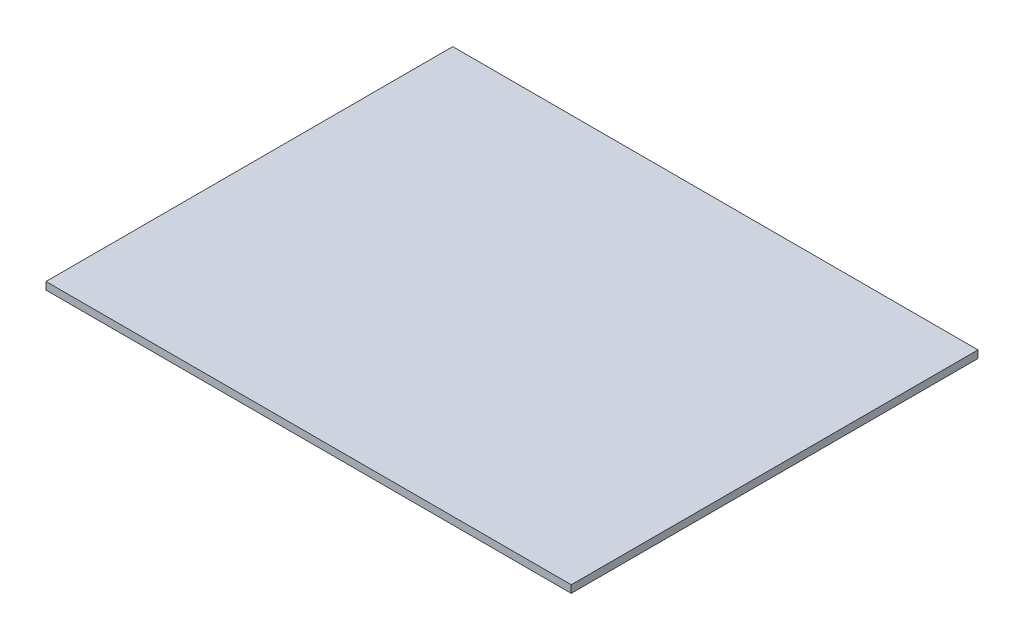
ISO-10303-21;
HEADER;
FILE_DESCRIPTION(('STEP AP214'),'2;1');
FILE_NAME('part.step','',(''),(''),'','','');
FILE_SCHEMA(('AUTOMOTIVE_DESIGN { 1 0 10303 214 1 1 1 1 }'));
ENDSEC;
DATA;
#1=APPLICATION_CONTEXT('core data for automotive mechanical design processes');
#2=APPLICATION_PROTOCOL_DEFINITION('international standard','automotive_design',2000,#1);
#3=PRODUCT_CONTEXT('',#1,'mechanical');
#4=PRODUCT('Part','Part','',(#3));
#5=PRODUCT_RELATED_PRODUCT_CATEGORY('part','',(#4));
#6=PRODUCT_DEFINITION_FORMATION('','',#4);
#7=PRODUCT_DEFINITION_CONTEXT('part definition',#1,'design');
#8=PRODUCT_DEFINITION('design','',#6,#7);
#9=PRODUCT_DEFINITION_SHAPE('','',#8);
#10=(LENGTH_UNIT() NAMED_UNIT(*) SI_UNIT(.MILLI.,.METRE.));
#11=(NAMED_UNIT(*) PLANE_ANGLE_UNIT() SI_UNIT($,.RADIAN.));
#12=(NAMED_UNIT(*) SI_UNIT($,.STERADIAN.) SOLID_ANGLE_UNIT());
#13=UNCERTAINTY_MEASURE_WITH_UNIT(LENGTH_MEASURE(1.E-05),#10,'distance_accuracy_value','');
#14=(GEOMETRIC_REPRESENTATION_CONTEXT(3) GLOBAL_UNCERTAINTY_ASSIGNED_CONTEXT((#13)) GLOBAL_UNIT_ASSIGNED_CONTEXT((#10,
#11,#12)) REPRESENTATION_CONTEXT('',''));
#15=CARTESIAN_POINT('',(0.,0.,0.));
#16=DIRECTION('',(0.,0.,1.));
#17=DIRECTION('',(1.,0.,0.));
#18=AXIS2_PLACEMENT_3D('',#15,#16,#17);
#19=CARTESIAN_POINT('',(772.,22.,597.833333333333));
#20=DIRECTION('',(0.,0.,-1.));
#21=DIRECTION('',(-1.,0.,0.));
#22=AXIS2_PLACEMENT_3D('',#19,#20,#21);
#23=PLANE('',#22);
#24=DIRECTION('',(1.,0.,0.));
#25=VECTOR('',#24,1.);
#26=CARTESIAN_POINT('',(772.,0.,597.833333333333));
#27=LINE('',#26,#25);
#28=CARTESIAN_POINT('',(-772.,0.,597.833333333334));
#29=VERTEX_POINT('',#28);
#30=CARTESIAN_POINT('',(772.,0.,597.833333333333));
#31=VERTEX_POINT('',#30);
#32=EDGE_CURVE('E98',#29,#31,#27,.T.);
#33=ORIENTED_EDGE('',*,*,#32,.T.);
#34=DIRECTION('',(0.,-1.,0.));
#35=VECTOR('',#34,1.);
#36=CARTESIAN_POINT('',(772.,22.,597.833333333333));
#37=LINE('',#36,#35);
#38=CARTESIAN_POINT('',(772.,22.,597.833333333333));
#39=VERTEX_POINT('',#38);
#40=EDGE_CURVE('E11',#39,#31,#37,.T.);
#41=ORIENTED_EDGE('',*,*,#40,.F.);
#42=DIRECTION('',(1.,0.,0.));
#43=VECTOR('',#42,1.);
#44=CARTESIAN_POINT('',(772.,22.,597.833333333333));
#45=LINE('',#44,#43);
#46=CARTESIAN_POINT('',(-772.,22.,597.833333333334));
#47=VERTEX_POINT('',#46);
#48=EDGE_CURVE('E86',#47,#39,#45,.T.);
#49=ORIENTED_EDGE('',*,*,#48,.F.);
#50=DIRECTION('',(0.,-1.,0.));
#51=VECTOR('',#50,1.);
#52=CARTESIAN_POINT('',(-772.,22.,597.833333333334));
#53=LINE('',#52,#51);
#54=EDGE_CURVE('E94',#47,#29,#53,.T.);
#55=ORIENTED_EDGE('',*,*,#54,.T.);
#56=EDGE_LOOP('',(#33,#41,#49,#55));
#57=FACE_BOUND('',#56,.T.);
#58=ADVANCED_FACE('F35',(#57),#23,.F.);
#59=CARTESIAN_POINT('',(772.,22.,597.833333333333));
#60=DIRECTION('',(-1.,0.,0.));
#61=DIRECTION('',(0.,0.,1.));
#62=AXIS2_PLACEMENT_3D('',#59,#60,#61);
#63=PLANE('',#62);
#64=DIRECTION('',(0.,0.,-1.));
#65=VECTOR('',#64,1.);
#66=CARTESIAN_POINT('',(772.,0.,597.833333333333));
#67=LINE('',#66,#65);
#68=CARTESIAN_POINT('',(772.,0.,-597.833333333334));
#69=VERTEX_POINT('',#68);
#70=EDGE_CURVE('E90',#31,#69,#67,.T.);
#71=ORIENTED_EDGE('',*,*,#70,.T.);
#72=DIRECTION('',(0.,-1.,0.));
#73=VECTOR('',#72,1.);
#74=CARTESIAN_POINT('',(772.,22.,-597.833333333334));
#75=LINE('',#74,#73);
#76=CARTESIAN_POINT('',(772.,22.,-597.833333333334));
#77=VERTEX_POINT('',#76);
#78=EDGE_CURVE('E43',#77,#69,#75,.T.);
#79=ORIENTED_EDGE('',*,*,#78,.F.);
#80=DIRECTION('',(0.,0.,-1.));
#81=VECTOR('',#80,1.);
#82=CARTESIAN_POINT('',(772.,22.,597.833333333333));
#83=LINE('',#82,#81);
#84=EDGE_CURVE('E81',#39,#77,#83,.T.);
#85=ORIENTED_EDGE('',*,*,#84,.F.);
#86=ORIENTED_EDGE('',*,*,#40,.T.);
#87=EDGE_LOOP('',(#71,#79,#85,#86));
#88=FACE_BOUND('',#87,.T.);
#89=ADVANCED_FACE('F89',(#88),#63,.F.);
#90=CARTESIAN_POINT('',(772.,22.,-597.833333333334));
#91=DIRECTION('',(0.,0.,1.));
#92=DIRECTION('',(1.,0.,0.));
#93=AXIS2_PLACEMENT_3D('',#90,#91,#92);
#94=PLANE('',#93);
#95=DIRECTION('',(-1.,0.,0.));
#96=VECTOR('',#95,1.);
#97=CARTESIAN_POINT('',(772.,0.,-597.833333333334));
#98=LINE('',#97,#96);
#99=CARTESIAN_POINT('',(-772.,0.,-597.833333333333));
#100=VERTEX_POINT('',#99);
#101=EDGE_CURVE('E68',#69,#100,#98,.T.);
#102=ORIENTED_EDGE('',*,*,#101,.T.);
#103=DIRECTION('',(0.,-1.,0.));
#104=VECTOR('',#103,1.);
#105=CARTESIAN_POINT('',(-772.,22.,-597.833333333333));
#106=LINE('',#105,#104);
#107=CARTESIAN_POINT('',(-772.,22.,-597.833333333333));
#108=VERTEX_POINT('',#107);
#109=EDGE_CURVE('E91',#108,#100,#106,.T.);
#110=ORIENTED_EDGE('',*,*,#109,.F.);
#111=DIRECTION('',(-1.,0.,0.));
#112=VECTOR('',#111,1.);
#113=CARTESIAN_POINT('',(772.,22.,-597.833333333334));
#114=LINE('',#113,#112);
#115=EDGE_CURVE('E84',#77,#108,#114,.T.);
#116=ORIENTED_EDGE('',*,*,#115,.F.);
#117=ORIENTED_EDGE('',*,*,#78,.T.);
#118=EDGE_LOOP('',(#102,#110,#116,#117));
#119=FACE_BOUND('',#118,.T.);
#120=ADVANCED_FACE('F92',(#119),#94,.F.);
#121=CARTESIAN_POINT('',(-772.,22.,597.833333333334));
#122=DIRECTION('',(1.,0.,0.));
#123=DIRECTION('',(0.,0.,-1.));
#124=AXIS2_PLACEMENT_3D('',#121,#122,#123);
#125=PLANE('',#124);
#126=DIRECTION('',(0.,0.,1.));
#127=VECTOR('',#126,1.);
#128=CARTESIAN_POINT('',(-772.,0.,597.833333333334));
#129=LINE('',#128,#127);
#130=EDGE_CURVE('E74',#100,#29,#129,.T.);
#131=ORIENTED_EDGE('',*,*,#130,.T.);
#132=ORIENTED_EDGE('',*,*,#54,.F.);
#133=DIRECTION('',(0.,0.,1.));
#134=VECTOR('',#133,1.);
#135=CARTESIAN_POINT('',(-772.,22.,597.833333333334));
#136=LINE('',#135,#134);
#137=EDGE_CURVE('E51',#108,#47,#136,.T.);
#138=ORIENTED_EDGE('',*,*,#137,.F.);
#139=ORIENTED_EDGE('',*,*,#109,.T.);
#140=EDGE_LOOP('',(#131,#132,#138,#139));
#141=FACE_BOUND('',#140,.T.);
#142=ADVANCED_FACE('F105',(#141),#125,.F.);
#143=CARTESIAN_POINT('',(0.,22.,0.));
#144=DIRECTION('',(0.,-1.,0.));
#145=DIRECTION('',(0.,0.,-1.));
#146=AXIS2_PLACEMENT_3D('',#143,#144,#145);
#147=PLANE('',#146);
#148=ORIENTED_EDGE('',*,*,#48,.T.);
#149=ORIENTED_EDGE('',*,*,#84,.T.);
#150=ORIENTED_EDGE('',*,*,#115,.T.);
#151=ORIENTED_EDGE('',*,*,#137,.T.);
#152=EDGE_LOOP('',(#148,#149,#150,#151));
#153=FACE_BOUND('',#152,.T.);
#154=ADVANCED_FACE('F82',(#153),#147,.F.);
#155=CARTESIAN_POINT('',(0.,0.,0.));
#156=DIRECTION('',(0.,-1.,0.));
#157=DIRECTION('',(0.,0.,-1.));
#158=AXIS2_PLACEMENT_3D('',#155,#156,#157);
#159=PLANE('',#158);
#160=ORIENTED_EDGE('',*,*,#32,.F.);
#161=ORIENTED_EDGE('',*,*,#130,.F.);
#162=ORIENTED_EDGE('',*,*,#101,.F.);
#163=ORIENTED_EDGE('',*,*,#70,.F.);
#164=EDGE_LOOP('',(#160,#161,#162,#163));
#165=FACE_BOUND('',#164,.T.);
#166=ADVANCED_FACE('F108',(#165),#159,.T.);
#167=CLOSED_SHELL('',(#58,#89,#120,#142,#154,#166));
#168=MANIFOLD_SOLID_BREP('B2',#167);
#169=ADVANCED_BREP_SHAPE_REPRESENTATION('',(#18,#168),#14);
#170=SHAPE_DEFINITION_REPRESENTATION(#9,#169);
ENDSEC;
END-ISO-10303-21;
